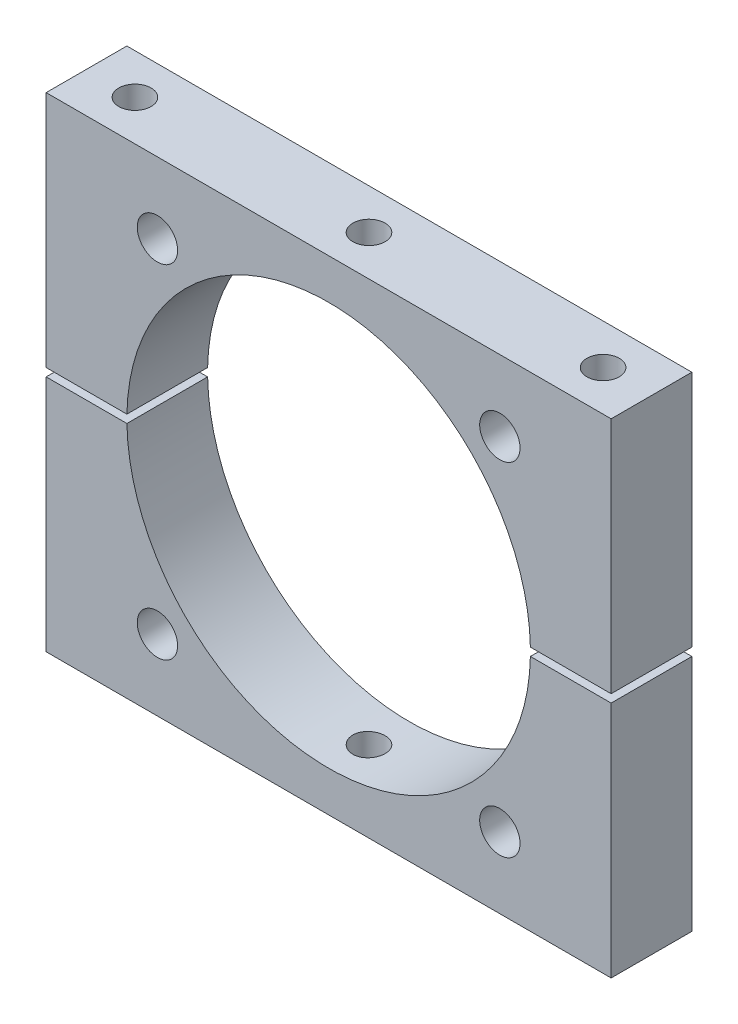
ISO-10303-21;
HEADER;
FILE_DESCRIPTION(('STEP AP214'),'2;1');
FILE_NAME('part.step','',(''),(''),'','','');
FILE_SCHEMA(('AUTOMOTIVE_DESIGN { 1 0 10303 214 1 1 1 1 }'));
ENDSEC;
DATA;
#1=APPLICATION_CONTEXT('core data for automotive mechanical design processes');
#2=APPLICATION_PROTOCOL_DEFINITION('international standard','automotive_design',2000,#1);
#3=PRODUCT_CONTEXT('',#1,'mechanical');
#4=PRODUCT('Part','Part','',(#3));
#5=PRODUCT_RELATED_PRODUCT_CATEGORY('part','',(#4));
#6=PRODUCT_DEFINITION_FORMATION('','',#4);
#7=PRODUCT_DEFINITION_CONTEXT('part definition',#1,'design');
#8=PRODUCT_DEFINITION('design','',#6,#7);
#9=PRODUCT_DEFINITION_SHAPE('','',#8);
#10=(LENGTH_UNIT() NAMED_UNIT(*) SI_UNIT(.MILLI.,.METRE.));
#11=(NAMED_UNIT(*) PLANE_ANGLE_UNIT() SI_UNIT($,.RADIAN.));
#12=(NAMED_UNIT(*) SI_UNIT($,.STERADIAN.) SOLID_ANGLE_UNIT());
#13=UNCERTAINTY_MEASURE_WITH_UNIT(LENGTH_MEASURE(1.E-05),#10,'distance_accuracy_value','');
#14=(GEOMETRIC_REPRESENTATION_CONTEXT(3) GLOBAL_UNCERTAINTY_ASSIGNED_CONTEXT((#13)) GLOBAL_UNIT_ASSIGNED_CONTEXT((#10,
#11,#12)) REPRESENTATION_CONTEXT('',''));
#15=CARTESIAN_POINT('',(0.,0.,0.));
#16=DIRECTION('',(0.,0.,1.));
#17=DIRECTION('',(1.,0.,0.));
#18=AXIS2_PLACEMENT_3D('',#15,#16,#17);
#19=CARTESIAN_POINT('',(0.,0.,10.));
#20=DIRECTION('',(1.,0.,0.));
#21=DIRECTION('',(0.,0.,-1.));
#22=AXIS2_PLACEMENT_3D('',#19,#20,#21);
#23=PLANE('',#22);
#24=DIRECTION('',(0.,-1.,0.));
#25=VECTOR('',#24,1.);
#26=CARTESIAN_POINT('',(0.,0.,10.));
#27=LINE('',#26,#25);
#28=CARTESIAN_POINT('',(0.,29.5,10.));
#29=VERTEX_POINT('',#28);
#30=CARTESIAN_POINT('',(0.,0.,10.));
#31=VERTEX_POINT('',#30);
#32=EDGE_CURVE('E130',#29,#31,#27,.T.);
#33=ORIENTED_EDGE('',*,*,#32,.F.);
#34=DIRECTION('',(0.,0.,1.));
#35=VECTOR('',#34,1.);
#36=CARTESIAN_POINT('',(0.,29.5,0.));
#37=LINE('',#36,#35);
#38=CARTESIAN_POINT('',(0.,29.5,0.));
#39=VERTEX_POINT('',#38);
#40=EDGE_CURVE('E12',#39,#29,#37,.T.);
#41=ORIENTED_EDGE('',*,*,#40,.F.);
#42=DIRECTION('',(0.,-1.,0.));
#43=VECTOR('',#42,1.);
#44=CARTESIAN_POINT('',(0.,0.,0.));
#45=LINE('',#44,#43);
#46=CARTESIAN_POINT('',(0.,0.,0.));
#47=VERTEX_POINT('',#46);
#48=EDGE_CURVE('E132',#39,#47,#45,.T.);
#49=ORIENTED_EDGE('',*,*,#48,.T.);
#50=DIRECTION('',(0.,0.,-1.));
#51=VECTOR('',#50,1.);
#52=CARTESIAN_POINT('',(0.,0.,10.));
#53=LINE('',#52,#51);
#54=EDGE_CURVE('E105',#31,#47,#53,.T.);
#55=ORIENTED_EDGE('',*,*,#54,.F.);
#56=EDGE_LOOP('',(#33,#41,#49,#55));
#57=FACE_BOUND('',#56,.T.);
#58=ADVANCED_FACE('F44',(#57),#23,.F.);
#59=CARTESIAN_POINT('',(0.,0.,10.));
#60=DIRECTION('',(0.,0.,-1.));
#61=DIRECTION('',(-1.,0.,0.));
#62=AXIS2_PLACEMENT_3D('',#59,#60,#61);
#63=PLANE('',#62);
#64=CARTESIAN_POINT('',(56.2132034355966,8.7867965644037,10.));
#65=DIRECTION('',(0.,0.,1.));
#66=DIRECTION('',(1.,0.,0.));
#67=AXIS2_PLACEMENT_3D('',#64,#65,#66);
#68=CIRCLE('',#67,2.5);
#69=CARTESIAN_POINT('',(58.7132034355966,8.7867965644037,10.));
#70=VERTEX_POINT('',#69);
#71=EDGE_CURVE('E211',#70,#70,#68,.T.);
#72=ORIENTED_EDGE('',*,*,#71,.F.);
#73=EDGE_LOOP('',(#72));
#74=FACE_BOUND('',#73,.T.);
#75=CARTESIAN_POINT('',(13.7867965644037,8.78679656440346,10.));
#76=DIRECTION('',(0.,0.,1.));
#77=DIRECTION('',(1.,0.,0.));
#78=AXIS2_PLACEMENT_3D('',#75,#76,#77);
#79=CIRCLE('',#78,2.5);
#80=CARTESIAN_POINT('',(16.2867965644037,8.78679656440346,10.));
#81=VERTEX_POINT('',#80);
#82=EDGE_CURVE('E205',#81,#81,#79,.T.);
#83=ORIENTED_EDGE('',*,*,#82,.F.);
#84=EDGE_LOOP('',(#83));
#85=FACE_BOUND('',#84,.T.);
#86=DIRECTION('',(0.,1.,0.));
#87=VECTOR('',#86,1.);
#88=CARTESIAN_POINT('',(70.,0.,10.));
#89=LINE('',#88,#87);
#90=CARTESIAN_POINT('',(70.,0.,10.));
#91=VERTEX_POINT('',#90);
#92=CARTESIAN_POINT('',(70.,29.5,10.));
#93=VERTEX_POINT('',#92);
#94=EDGE_CURVE('E117',#91,#93,#89,.T.);
#95=ORIENTED_EDGE('',*,*,#94,.T.);
#96=DIRECTION('',(1.,0.,0.));
#97=VECTOR('',#96,1.);
#98=CARTESIAN_POINT('',(70.,29.5,10.));
#99=LINE('',#98,#97);
#100=CARTESIAN_POINT('',(59.9949994999,29.5,10.));
#101=VERTEX_POINT('',#100);
#102=EDGE_CURVE('E118',#101,#93,#99,.T.);
#103=ORIENTED_EDGE('',*,*,#102,.F.);
#104=CARTESIAN_POINT('',(35.,30.,10.));
#105=DIRECTION('',(0.,0.,1.));
#106=DIRECTION('',(1.,0.,0.));
#107=AXIS2_PLACEMENT_3D('',#104,#105,#106);
#108=CIRCLE('',#107,25.);
#109=CARTESIAN_POINT('',(10.0050005001,29.5,10.));
#110=VERTEX_POINT('',#109);
#111=EDGE_CURVE('E190',#110,#101,#108,.T.);
#112=ORIENTED_EDGE('',*,*,#111,.F.);
#113=DIRECTION('',(1.,0.,0.));
#114=VECTOR('',#113,1.);
#115=CARTESIAN_POINT('',(0.,29.5,10.));
#116=LINE('',#115,#114);
#117=EDGE_CURVE('E53',#29,#110,#116,.T.);
#118=ORIENTED_EDGE('',*,*,#117,.F.);
#119=ORIENTED_EDGE('',*,*,#32,.T.);
#120=DIRECTION('',(1.,0.,0.));
#121=VECTOR('',#120,1.);
#122=CARTESIAN_POINT('',(0.,0.,10.));
#123=LINE('',#122,#121);
#124=EDGE_CURVE('E179',#31,#91,#123,.T.);
#125=ORIENTED_EDGE('',*,*,#124,.T.);
#126=EDGE_LOOP('',(#95,#103,#112,#118,#119,#125));
#127=FACE_BOUND('',#126,.T.);
#128=ADVANCED_FACE('F170',(#74,#85,#127),#63,.F.);
#129=CARTESIAN_POINT('',(0.,0.,0.));
#130=DIRECTION('',(0.,0.,-1.));
#131=DIRECTION('',(-1.,0.,0.));
#132=AXIS2_PLACEMENT_3D('',#129,#130,#131);
#133=PLANE('',#132);
#134=CARTESIAN_POINT('',(56.2132034355966,8.7867965644037,0.));
#135=DIRECTION('',(0.,0.,1.));
#136=DIRECTION('',(1.,0.,0.));
#137=AXIS2_PLACEMENT_3D('',#134,#135,#136);
#138=CIRCLE('',#137,2.5);
#139=CARTESIAN_POINT('',(58.7132034355966,8.7867965644037,0.));
#140=VERTEX_POINT('',#139);
#141=EDGE_CURVE('E200',#140,#140,#138,.T.);
#142=ORIENTED_EDGE('',*,*,#141,.T.);
#143=EDGE_LOOP('',(#142));
#144=FACE_BOUND('',#143,.T.);
#145=CARTESIAN_POINT('',(13.7867965644037,8.78679656440346,0.));
#146=DIRECTION('',(0.,0.,1.));
#147=DIRECTION('',(1.,0.,0.));
#148=AXIS2_PLACEMENT_3D('',#145,#146,#147);
#149=CIRCLE('',#148,2.5);
#150=CARTESIAN_POINT('',(16.2867965644037,8.78679656440346,0.));
#151=VERTEX_POINT('',#150);
#152=EDGE_CURVE('E208',#151,#151,#149,.T.);
#153=ORIENTED_EDGE('',*,*,#152,.T.);
#154=EDGE_LOOP('',(#153));
#155=FACE_BOUND('',#154,.T.);
#156=DIRECTION('',(1.,0.,0.));
#157=VECTOR('',#156,1.);
#158=CARTESIAN_POINT('',(70.,29.5,0.));
#159=LINE('',#158,#157);
#160=CARTESIAN_POINT('',(59.9949994999,29.5,0.));
#161=VERTEX_POINT('',#160);
#162=CARTESIAN_POINT('',(70.,29.5,0.));
#163=VERTEX_POINT('',#162);
#164=EDGE_CURVE('E124',#161,#163,#159,.T.);
#165=ORIENTED_EDGE('',*,*,#164,.T.);
#166=DIRECTION('',(0.,1.,0.));
#167=VECTOR('',#166,1.);
#168=CARTESIAN_POINT('',(70.,0.,0.));
#169=LINE('',#168,#167);
#170=CARTESIAN_POINT('',(70.,0.,0.));
#171=VERTEX_POINT('',#170);
#172=EDGE_CURVE('E115',#171,#163,#169,.T.);
#173=ORIENTED_EDGE('',*,*,#172,.F.);
#174=DIRECTION('',(1.,0.,0.));
#175=VECTOR('',#174,1.);
#176=CARTESIAN_POINT('',(0.,0.,0.));
#177=LINE('',#176,#175);
#178=EDGE_CURVE('E98',#47,#171,#177,.T.);
#179=ORIENTED_EDGE('',*,*,#178,.F.);
#180=ORIENTED_EDGE('',*,*,#48,.F.);
#181=DIRECTION('',(1.,0.,0.));
#182=VECTOR('',#181,1.);
#183=CARTESIAN_POINT('',(0.,29.5,0.));
#184=LINE('',#183,#182);
#185=CARTESIAN_POINT('',(10.0050005001,29.5,0.));
#186=VERTEX_POINT('',#185);
#187=EDGE_CURVE('E183',#39,#186,#184,.T.);
#188=ORIENTED_EDGE('',*,*,#187,.T.);
#189=CARTESIAN_POINT('',(35.,30.,0.));
#190=DIRECTION('',(0.,0.,1.));
#191=DIRECTION('',(1.,0.,0.));
#192=AXIS2_PLACEMENT_3D('',#189,#190,#191);
#193=CIRCLE('',#192,25.);
#194=EDGE_CURVE('E109',#186,#161,#193,.T.);
#195=ORIENTED_EDGE('',*,*,#194,.T.);
#196=EDGE_LOOP('',(#165,#173,#179,#180,#188,#195));
#197=FACE_BOUND('',#196,.T.);
#198=ADVANCED_FACE('F122',(#144,#155,#197),#133,.T.);
#199=CARTESIAN_POINT('',(0.,0.,10.));
#200=DIRECTION('',(0.,1.,0.));
#201=DIRECTION('',(0.,0.,1.));
#202=AXIS2_PLACEMENT_3D('',#199,#200,#201);
#203=PLANE('',#202);
#204=CARTESIAN_POINT('',(5.99999999999998,0.,5.));
#205=DIRECTION('',(0.,1.,0.));
#206=DIRECTION('',(-1.,0.,0.));
#207=AXIS2_PLACEMENT_3D('',#204,#205,#206);
#208=CIRCLE('',#207,2.);
#209=CARTESIAN_POINT('',(3.99999999999998,0.,5.));
#210=VERTEX_POINT('',#209);
#211=EDGE_CURVE('E137',#210,#210,#208,.T.);
#212=ORIENTED_EDGE('',*,*,#211,.T.);
#213=EDGE_LOOP('',(#212));
#214=FACE_BOUND('',#213,.T.);
#215=CARTESIAN_POINT('',(64.,0.,5.));
#216=DIRECTION('',(0.,1.,0.));
#217=DIRECTION('',(-1.,0.,0.));
#218=AXIS2_PLACEMENT_3D('',#215,#216,#217);
#219=CIRCLE('',#218,2.);
#220=CARTESIAN_POINT('',(62.,0.,5.));
#221=VERTEX_POINT('',#220);
#222=EDGE_CURVE('E199',#221,#221,#219,.T.);
#223=ORIENTED_EDGE('',*,*,#222,.T.);
#224=EDGE_LOOP('',(#223));
#225=FACE_BOUND('',#224,.T.);
#226=CARTESIAN_POINT('',(35.,0.,5.));
#227=DIRECTION('',(0.,1.,0.));
#228=DIRECTION('',(-1.,0.,0.));
#229=AXIS2_PLACEMENT_3D('',#226,#227,#228);
#230=CIRCLE('',#229,2.);
#231=CARTESIAN_POINT('',(33.,0.,5.));
#232=VERTEX_POINT('',#231);
#233=EDGE_CURVE('E196',#232,#232,#230,.T.);
#234=ORIENTED_EDGE('',*,*,#233,.T.);
#235=EDGE_LOOP('',(#234));
#236=FACE_BOUND('',#235,.T.);
#237=ORIENTED_EDGE('',*,*,#178,.T.);
#238=DIRECTION('',(0.,0.,-1.));
#239=VECTOR('',#238,1.);
#240=CARTESIAN_POINT('',(70.,0.,10.));
#241=LINE('',#240,#239);
#242=EDGE_CURVE('E102',#91,#171,#241,.T.);
#243=ORIENTED_EDGE('',*,*,#242,.F.);
#244=ORIENTED_EDGE('',*,*,#124,.F.);
#245=ORIENTED_EDGE('',*,*,#54,.T.);
#246=EDGE_LOOP('',(#237,#243,#244,#245));
#247=FACE_BOUND('',#246,.T.);
#248=ADVANCED_FACE('F100',(#214,#225,#236,#247),#203,.F.);
#249=CARTESIAN_POINT('',(70.,0.,10.));
#250=DIRECTION('',(-1.,0.,0.));
#251=DIRECTION('',(0.,0.,1.));
#252=AXIS2_PLACEMENT_3D('',#249,#250,#251);
#253=PLANE('',#252);
#254=ORIENTED_EDGE('',*,*,#172,.T.);
#255=DIRECTION('',(0.,0.,1.));
#256=VECTOR('',#255,1.);
#257=CARTESIAN_POINT('',(70.,29.5,0.));
#258=LINE('',#257,#256);
#259=EDGE_CURVE('E119',#163,#93,#258,.T.);
#260=ORIENTED_EDGE('',*,*,#259,.T.);
#261=ORIENTED_EDGE('',*,*,#94,.F.);
#262=ORIENTED_EDGE('',*,*,#242,.T.);
#263=EDGE_LOOP('',(#254,#260,#261,#262));
#264=FACE_BOUND('',#263,.T.);
#265=ADVANCED_FACE('F113',(#264),#253,.F.);
#266=CARTESIAN_POINT('',(70.,29.5,0.));
#267=DIRECTION('',(0.,-1.,0.));
#268=DIRECTION('',(1.,0.,0.));
#269=AXIS2_PLACEMENT_3D('',#266,#267,#268);
#270=PLANE('',#269);
#271=CARTESIAN_POINT('',(64.,29.5,5.));
#272=DIRECTION('',(0.,-1.,0.));
#273=DIRECTION('',(1.,0.,0.));
#274=AXIS2_PLACEMENT_3D('',#271,#272,#273);
#275=CIRCLE('',#274,2.);
#276=CARTESIAN_POINT('',(66.,29.5,5.));
#277=VERTEX_POINT('',#276);
#278=EDGE_CURVE('E47',#277,#277,#275,.T.);
#279=ORIENTED_EDGE('',*,*,#278,.T.);
#280=EDGE_LOOP('',(#279));
#281=FACE_BOUND('',#280,.T.);
#282=ORIENTED_EDGE('',*,*,#102,.T.);
#283=ORIENTED_EDGE('',*,*,#259,.F.);
#284=ORIENTED_EDGE('',*,*,#164,.F.);
#285=DIRECTION('',(0.,0.,1.));
#286=VECTOR('',#285,1.);
#287=CARTESIAN_POINT('',(59.9949994999,29.5,0.));
#288=LINE('',#287,#286);
#289=EDGE_CURVE('E76',#161,#101,#288,.T.);
#290=ORIENTED_EDGE('',*,*,#289,.T.);
#291=EDGE_LOOP('',(#282,#283,#284,#290));
#292=FACE_BOUND('',#291,.T.);
#293=ADVANCED_FACE('F167',(#281,#292),#270,.F.);
#294=CARTESIAN_POINT('',(35.,30.,0.));
#295=DIRECTION('',(0.,0.,1.));
#296=DIRECTION('',(1.,0.,0.));
#297=AXIS2_PLACEMENT_3D('',#294,#295,#296);
#298=CYLINDRICAL_SURFACE('',#297,25.);
#299=CARTESIAN_POINT('',(33.,5.08012841124579,5.));
#300=CARTESIAN_POINT('',(33.0000049058297,5.08012734773147,4.88785214632583));
#301=CARTESIAN_POINT('',(33.0094645837975,5.07936320771224,4.77562755360826));
#302=CARTESIAN_POINT('',(33.0470624163415,5.07638917242891,4.55428234358477));
#303=CARTESIAN_POINT('',(33.0752218385444,5.07417763104509,4.4451654082191));
#304=CARTESIAN_POINT('',(33.1494005463485,5.06856087303916,4.23327344182202));
#305=CARTESIAN_POINT('',(33.1954098318099,5.06515632488582,4.13049489709423));
#306=CARTESIAN_POINT('',(33.3039647194289,5.05753799933324,3.93414429234462));
#307=CARTESIAN_POINT('',(33.3665067414178,5.05332439718886,3.84057024509866));
#308=CARTESIAN_POINT('',(33.5065126422468,5.04455147782463,3.66503758891781));
#309=CARTESIAN_POINT('',(33.5840076675593,5.03999145125225,3.58310385583312));
#310=CARTESIAN_POINT('',(33.7516540723195,5.03104599547927,3.43339121946791));
#311=CARTESIAN_POINT('',(33.8418059998821,5.0266605738506,3.36561292951396));
#312=CARTESIAN_POINT('',(34.0323544420321,5.01855180621899,3.24605323296989));
#313=CARTESIAN_POINT('',(34.1327644244599,5.01482934866933,3.19429322537689));
#314=CARTESIAN_POINT('',(34.3408846785481,5.00847355216113,3.10837625933676));
#315=CARTESIAN_POINT('',(34.4485948313103,5.0058401954693,3.07421901427029));
#316=CARTESIAN_POINT('',(34.6680113389855,5.001964259375,3.02454843680447));
#317=CARTESIAN_POINT('',(34.7797085663302,5.00071869027013,3.00899502094729));
#318=CARTESIAN_POINT('',(35.0041346856336,4.99974854930884,2.9968497166359));
#319=CARTESIAN_POINT('',(35.1168635597254,5.00002395116042,3.00025750041233));
#320=CARTESIAN_POINT('',(35.339881278461,5.00206225037521,3.02590503221525));
#321=CARTESIAN_POINT('',(35.4501751157608,5.0038217429086,3.04810167488849));
#322=CARTESIAN_POINT('',(35.6654666002531,5.00862637101554,3.11062984172019));
#323=CARTESIAN_POINT('',(35.7704642004069,5.01167151800542,3.15096152691411));
#324=CARTESIAN_POINT('',(35.9723201008381,5.0187106835816,3.24866309042891));
#325=CARTESIAN_POINT('',(36.0691689982204,5.02270577853434,3.30605231487255));
#326=CARTESIAN_POINT('',(36.2518756725195,5.03119575879567,3.43622583750934));
#327=CARTESIAN_POINT('',(36.3377332442022,5.03569065343378,3.50901042310295));
#328=CARTESIAN_POINT('',(36.4962720389694,5.04468981488671,3.66815161626229));
#329=CARTESIAN_POINT('',(36.5689156773006,5.04919407268298,3.75454567206777));
#330=CARTESIAN_POINT('',(36.6986742538885,5.05769161227713,3.93832276653583));
#331=CARTESIAN_POINT('',(36.7557891807526,5.06168489370012,4.03570581326042));
#332=CARTESIAN_POINT('',(36.8528673981887,5.06870915540073,4.23872248572451));
#333=CARTESIAN_POINT('',(36.8928288041141,5.0717400299298,4.34435701654316));
#334=CARTESIAN_POINT('',(36.9544381331901,5.0764943330086,4.56086578550857));
#335=CARTESIAN_POINT('',(36.9760864107929,5.07821778686352,4.67173992219839));
#336=CARTESIAN_POINT('',(37.000407523715,5.08015808256602,4.89525189649534));
#337=CARTESIAN_POINT('',(37.0031327414394,5.0803790834359,5.00788399962282));
#338=CARTESIAN_POINT('',(36.9896675278023,5.07930043172132,5.23200349472847));
#339=CARTESIAN_POINT('',(36.9734772588428,5.07800079219257,5.34349089652637));
#340=CARTESIAN_POINT('',(36.9226842955202,5.07403109312339,5.56200629468562));
#341=CARTESIAN_POINT('',(36.8881059892899,5.07136284893502,5.66903999573583));
#342=CARTESIAN_POINT('',(36.8015432785373,5.06495810211958,5.87578629884753));
#343=CARTESIAN_POINT('',(36.7495586162864,5.06122158367515,5.97549879248032));
#344=CARTESIAN_POINT('',(36.6295260627595,5.05309122361194,6.16501207928401));
#345=CARTESIAN_POINT('',(36.561443230421,5.04869595989389,6.25479067981361));
#346=CARTESIAN_POINT('',(36.4111974912002,5.03974819229543,6.4216635305496));
#347=CARTESIAN_POINT('',(36.3290343608448,5.03519568592029,6.49875757939722));
#348=CARTESIAN_POINT('',(36.1527341363514,5.02643404533033,6.63825137667553));
#349=CARTESIAN_POINT('',(36.0585700870042,5.02222572023454,6.70061711536531));
#350=CARTESIAN_POINT('',(35.8610755210211,5.01463826185632,6.80865071989545));
#351=CARTESIAN_POINT('',(35.7577450898037,5.0112591208481,6.85431874131599));
#352=CARTESIAN_POINT('',(35.5449733633069,5.00571451349841,6.92760202065291));
#353=CARTESIAN_POINT('',(35.4355393803821,5.00354762776069,6.95523839765751));
#354=CARTESIAN_POINT('',(35.2135664449589,5.00066593349759,6.99174293337583));
#355=CARTESIAN_POINT('',(35.1010275462014,4.99995109985558,7.00061141672435));
#356=CARTESIAN_POINT('',(34.8763748177972,5.00005400574249,6.99932476322648));
#357=CARTESIAN_POINT('',(34.7642606785877,5.00086747220173,6.98922266744312));
#358=CARTESIAN_POINT('',(34.543326600899,5.00392711142839,6.95039211378512));
#359=CARTESIAN_POINT('',(34.434506667172,5.00617328626259,6.92166362904064));
#360=CARTESIAN_POINT('',(34.2232458147354,5.01184624477969,6.84640903482433));
#361=CARTESIAN_POINT('',(34.1208045965354,5.01527297298441,6.79988376167241));
#362=CARTESIAN_POINT('',(33.9251787543047,5.02292342725981,6.69036249537071));
#363=CARTESIAN_POINT('',(33.8319939672824,5.02714713929305,6.62736679231073));
#364=CARTESIAN_POINT('',(33.6572549348515,5.03593135912912,6.48649399715609));
#365=CARTESIAN_POINT('',(33.5757323027529,5.04049273335708,6.40857774622938));
#366=CARTESIAN_POINT('',(33.4268903357378,5.04943083951522,6.24014438954589));
#367=CARTESIAN_POINT('',(33.3595744515429,5.05380752638004,6.14962423122778));
#368=CARTESIAN_POINT('',(33.2409732717279,5.06188908798036,5.95839006551097));
#369=CARTESIAN_POINT('',(33.1897163652296,5.06559276817313,5.85765841750696));
#370=CARTESIAN_POINT('',(33.1049085973296,5.07189429980017,5.64905850357319));
#371=CARTESIAN_POINT('',(33.0713373109053,5.07449342620347,5.54119863279941));
#372=CARTESIAN_POINT('',(33.0314354938912,5.0776208301853,5.36058173591769));
#373=CARTESIAN_POINT('',(33.0196627768964,5.07855687212748,5.28898746472167));
#374=CARTESIAN_POINT('',(33.003943454081,5.07981100560018,5.14493948037199));
#375=CARTESIAN_POINT('',(32.9999968291605,5.08012909863883,5.07248576931625));
#376=CARTESIAN_POINT('',(33.,5.08012841124579,5.));
#377=B_SPLINE_CURVE_WITH_KNOTS('',3,(#299,#300,#301,#302,#303,#304,#305,#306,#307,#308,#309,
#310,#311,#312,#313,#314,#315,#316,#317,#318,#319,#320,#321,#322,#323,#324,#325,#326,#327,#328,
#329,#330,#331,#332,#333,#334,#335,#336,#337,#338,#339,#340,#341,#342,#343,#344,#345,#346,#347,
#348,#349,#350,#351,#352,#353,#354,#355,#356,#357,#358,#359,#360,#361,#362,#363,#364,#365,#366,
#367,#368,#369,#370,#371,#372,#373,#374,#375,#376),.UNSPECIFIED.,.T.,.F.,(4,2,2,2,2,2,2,2,2,2,2,
2,2,2,2,2,2,2,2,2,2,2,2,2,2,2,2,2,2,2,2,2,2,2,2,2,2,2,4),(0.,0.33617890938388,0.672740818698467,
1.00911444549431,1.34541529007444,1.68242434822536,2.0194480052657,2.35691997146201,
2.69438644255223,3.03112449746249,3.36785673142908,3.70381852241059,4.03978329672298,
4.37613057520016,4.71248413315914,5.04977992078599,5.38707595587001,5.72440903998027,
6.06173559482743,6.39812799600616,6.73451750905467,7.07046197594159,7.40641141723674,
7.7430968405756,8.07978760805434,8.41724840176262,8.75470605111592,9.09176774920682,
9.42882361697637,9.76493849142071,10.101053850735,10.4371534170066,10.7732470640349,
11.1102351838792,11.4473050618615,11.7849674942507,12.1222391025421,12.3395258855511,
12.5568121382634),.UNSPECIFIED.);
#378=CARTESIAN_POINT('',(33.,5.08012841124579,5.));
#379=VERTEX_POINT('',#378);
#380=EDGE_CURVE('E136',#379,#379,#377,.T.);
#381=ORIENTED_EDGE('',*,*,#380,.T.);
#382=EDGE_LOOP('',(#381));
#383=FACE_BOUND('',#382,.T.);
#384=ORIENTED_EDGE('',*,*,#111,.T.);
#385=ORIENTED_EDGE('',*,*,#289,.F.);
#386=ORIENTED_EDGE('',*,*,#194,.F.);
#387=DIRECTION('',(0.,0.,1.));
#388=VECTOR('',#387,1.);
#389=CARTESIAN_POINT('',(10.0050005001,29.5,0.));
#390=LINE('',#389,#388);
#391=EDGE_CURVE('E189',#186,#110,#390,.T.);
#392=ORIENTED_EDGE('',*,*,#391,.T.);
#393=EDGE_LOOP('',(#384,#385,#386,#392));
#394=FACE_BOUND('',#393,.T.);
#395=ADVANCED_FACE('F144',(#383,#394),#298,.F.);
#396=CARTESIAN_POINT('',(0.,29.5,0.));
#397=DIRECTION('',(0.,-1.,0.));
#398=DIRECTION('',(1.,0.,0.));
#399=AXIS2_PLACEMENT_3D('',#396,#397,#398);
#400=PLANE('',#399);
#401=CARTESIAN_POINT('',(5.99999999999999,29.5,5.));
#402=DIRECTION('',(0.,-1.,0.));
#403=DIRECTION('',(1.,0.,0.));
#404=AXIS2_PLACEMENT_3D('',#401,#402,#403);
#405=CIRCLE('',#404,2.);
#406=CARTESIAN_POINT('',(7.99999999999999,29.5,5.));
#407=VERTEX_POINT('',#406);
#408=EDGE_CURVE('E134',#407,#407,#405,.T.);
#409=ORIENTED_EDGE('',*,*,#408,.T.);
#410=EDGE_LOOP('',(#409));
#411=FACE_BOUND('',#410,.T.);
#412=ORIENTED_EDGE('',*,*,#117,.T.);
#413=ORIENTED_EDGE('',*,*,#391,.F.);
#414=ORIENTED_EDGE('',*,*,#187,.F.);
#415=ORIENTED_EDGE('',*,*,#40,.T.);
#416=EDGE_LOOP('',(#412,#413,#414,#415));
#417=FACE_BOUND('',#416,.T.);
#418=ADVANCED_FACE('F159',(#411,#417),#400,.F.);
#419=CARTESIAN_POINT('',(5.99999999999998,0.,5.));
#420=DIRECTION('',(0.,1.,0.));
#421=DIRECTION('',(-1.,0.,0.));
#422=AXIS2_PLACEMENT_3D('',#419,#420,#421);
#423=CYLINDRICAL_SURFACE('',#422,2.);
#424=ORIENTED_EDGE('',*,*,#211,.F.);
#425=EDGE_LOOP('',(#424));
#426=FACE_BOUND('',#425,.T.);
#427=ORIENTED_EDGE('',*,*,#408,.F.);
#428=EDGE_LOOP('',(#427));
#429=FACE_BOUND('',#428,.T.);
#430=ADVANCED_FACE('F154',(#426,#429),#423,.F.);
#431=CARTESIAN_POINT('',(35.,0.,5.));
#432=DIRECTION('',(0.,1.,0.));
#433=DIRECTION('',(-1.,0.,0.));
#434=AXIS2_PLACEMENT_3D('',#431,#432,#433);
#435=CYLINDRICAL_SURFACE('',#434,2.);
#436=ORIENTED_EDGE('',*,*,#233,.F.);
#437=EDGE_LOOP('',(#436));
#438=FACE_BOUND('',#437,.T.);
#439=ORIENTED_EDGE('',*,*,#380,.F.);
#440=EDGE_LOOP('',(#439));
#441=FACE_BOUND('',#440,.T.);
#442=ADVANCED_FACE('F148',(#438,#441),#435,.F.);
#443=CARTESIAN_POINT('',(64.,0.,5.));
#444=DIRECTION('',(0.,1.,0.));
#445=DIRECTION('',(-1.,0.,0.));
#446=AXIS2_PLACEMENT_3D('',#443,#444,#445);
#447=CYLINDRICAL_SURFACE('',#446,2.);
#448=ORIENTED_EDGE('',*,*,#222,.F.);
#449=EDGE_LOOP('',(#448));
#450=FACE_BOUND('',#449,.T.);
#451=ORIENTED_EDGE('',*,*,#278,.F.);
#452=EDGE_LOOP('',(#451));
#453=FACE_BOUND('',#452,.T.);
#454=ADVANCED_FACE('F153',(#450,#453),#447,.F.);
#455=CARTESIAN_POINT('',(13.7867965644037,8.78679656440346,0.));
#456=DIRECTION('',(0.,0.,1.));
#457=DIRECTION('',(1.,0.,0.));
#458=AXIS2_PLACEMENT_3D('',#455,#456,#457);
#459=CYLINDRICAL_SURFACE('',#458,2.5);
#460=ORIENTED_EDGE('',*,*,#152,.F.);
#461=EDGE_LOOP('',(#460));
#462=FACE_BOUND('',#461,.T.);
#463=ORIENTED_EDGE('',*,*,#82,.T.);
#464=EDGE_LOOP('',(#463));
#465=FACE_BOUND('',#464,.T.);
#466=ADVANCED_FACE('F222',(#462,#465),#459,.F.);
#467=CARTESIAN_POINT('',(56.2132034355966,8.7867965644037,0.));
#468=DIRECTION('',(0.,0.,1.));
#469=DIRECTION('',(1.,0.,0.));
#470=AXIS2_PLACEMENT_3D('',#467,#468,#469);
#471=CYLINDRICAL_SURFACE('',#470,2.5);
#472=ORIENTED_EDGE('',*,*,#141,.F.);
#473=EDGE_LOOP('',(#472));
#474=FACE_BOUND('',#473,.T.);
#475=ORIENTED_EDGE('',*,*,#71,.T.);
#476=EDGE_LOOP('',(#475));
#477=FACE_BOUND('',#476,.T.);
#478=ADVANCED_FACE('F219',(#474,#477),#471,.F.);
#479=CLOSED_SHELL('',(#58,#128,#198,#248,#265,#293,#395,#418,#430,#442,#454,#466,#478));
#480=MANIFOLD_SOLID_BREP('B2',#479);
#481=CARTESIAN_POINT('',(0.,60.,10.));
#482=DIRECTION('',(0.,-1.,0.));
#483=DIRECTION('',(0.,0.,-1.));
#484=AXIS2_PLACEMENT_3D('',#481,#482,#483);
#485=PLANE('',#484);
#486=CARTESIAN_POINT('',(6.,60.,5.));
#487=DIRECTION('',(0.,1.,0.));
#488=DIRECTION('',(-1.,0.,0.));
#489=AXIS2_PLACEMENT_3D('',#486,#487,#488);
#490=CIRCLE('',#489,2.);
#491=CARTESIAN_POINT('',(4.,60.,5.));
#492=VERTEX_POINT('',#491);
#493=EDGE_CURVE('E402',#492,#492,#490,.T.);
#494=ORIENTED_EDGE('',*,*,#493,.F.);
#495=EDGE_LOOP('',(#494));
#496=FACE_BOUND('',#495,.T.);
#497=CARTESIAN_POINT('',(64.,60.,5.));
#498=DIRECTION('',(0.,1.,0.));
#499=DIRECTION('',(-1.,0.,0.));
#500=AXIS2_PLACEMENT_3D('',#497,#498,#499);
#501=CIRCLE('',#500,2.);
#502=CARTESIAN_POINT('',(62.,60.,5.));
#503=VERTEX_POINT('',#502);
#504=EDGE_CURVE('E476',#503,#503,#501,.T.);
#505=ORIENTED_EDGE('',*,*,#504,.F.);
#506=EDGE_LOOP('',(#505));
#507=FACE_BOUND('',#506,.T.);
#508=CARTESIAN_POINT('',(35.,60.,5.));
#509=DIRECTION('',(0.,1.,0.));
#510=DIRECTION('',(-1.,0.,0.));
#511=AXIS2_PLACEMENT_3D('',#508,#509,#510);
#512=CIRCLE('',#511,2.);
#513=CARTESIAN_POINT('',(33.,60.,5.));
#514=VERTEX_POINT('',#513);
#515=EDGE_CURVE('E473',#514,#514,#512,.T.);
#516=ORIENTED_EDGE('',*,*,#515,.F.);
#517=EDGE_LOOP('',(#516));
#518=FACE_BOUND('',#517,.T.);
#519=DIRECTION('',(-1.,0.,0.));
#520=VECTOR('',#519,1.);
#521=CARTESIAN_POINT('',(0.,60.,0.));
#522=LINE('',#521,#520);
#523=CARTESIAN_POINT('',(70.,60.,0.));
#524=VERTEX_POINT('',#523);
#525=CARTESIAN_POINT('',(0.,60.,0.));
#526=VERTEX_POINT('',#525);
#527=EDGE_CURVE('E367',#524,#526,#522,.T.);
#528=ORIENTED_EDGE('',*,*,#527,.T.);
#529=DIRECTION('',(0.,0.,-1.));
#530=VECTOR('',#529,1.);
#531=CARTESIAN_POINT('',(0.,60.,10.));
#532=LINE('',#531,#530);
#533=CARTESIAN_POINT('',(0.,60.,10.));
#534=VERTEX_POINT('',#533);
#535=EDGE_CURVE('E338',#534,#526,#532,.T.);
#536=ORIENTED_EDGE('',*,*,#535,.F.);
#537=DIRECTION('',(-1.,0.,0.));
#538=VECTOR('',#537,1.);
#539=CARTESIAN_POINT('',(0.,60.,10.));
#540=LINE('',#539,#538);
#541=CARTESIAN_POINT('',(70.,60.,10.));
#542=VERTEX_POINT('',#541);
#543=EDGE_CURVE('E355',#542,#534,#540,.T.);
#544=ORIENTED_EDGE('',*,*,#543,.F.);
#545=DIRECTION('',(0.,0.,-1.));
#546=VECTOR('',#545,1.);
#547=CARTESIAN_POINT('',(70.,60.,10.));
#548=LINE('',#547,#546);
#549=EDGE_CURVE('E42',#542,#524,#548,.T.);
#550=ORIENTED_EDGE('',*,*,#549,.T.);
#551=EDGE_LOOP('',(#528,#536,#544,#550));
#552=FACE_BOUND('',#551,.T.);
#553=ADVANCED_FACE('F329',(#496,#507,#518,#552),#485,.F.);
#554=CARTESIAN_POINT('',(0.,0.,0.));
#555=DIRECTION('',(0.,0.,-1.));
#556=DIRECTION('',(-1.,0.,0.));
#557=AXIS2_PLACEMENT_3D('',#554,#555,#556);
#558=PLANE('',#557);
#559=CARTESIAN_POINT('',(13.7867965644035,51.2132034355963,0.));
#560=DIRECTION('',(0.,0.,1.));
#561=DIRECTION('',(1.,0.,0.));
#562=AXIS2_PLACEMENT_3D('',#559,#560,#561);
#563=CIRCLE('',#562,2.5);
#564=CARTESIAN_POINT('',(16.2867965644035,51.2132034355963,0.));
#565=VERTEX_POINT('',#564);
#566=EDGE_CURVE('E477',#565,#565,#563,.T.);
#567=ORIENTED_EDGE('',*,*,#566,.T.);
#568=EDGE_LOOP('',(#567));
#569=FACE_BOUND('',#568,.T.);
#570=CARTESIAN_POINT('',(56.2132034355963,51.2132034355965,0.));
#571=DIRECTION('',(0.,0.,1.));
#572=DIRECTION('',(1.,0.,0.));
#573=AXIS2_PLACEMENT_3D('',#570,#571,#572);
#574=CIRCLE('',#573,2.50000000000001);
#575=CARTESIAN_POINT('',(58.7132034355963,51.2132034355965,0.));
#576=VERTEX_POINT('',#575);
#577=EDGE_CURVE('E485',#576,#576,#574,.T.);
#578=ORIENTED_EDGE('',*,*,#577,.T.);
#579=EDGE_LOOP('',(#578));
#580=FACE_BOUND('',#579,.T.);
#581=DIRECTION('',(-1.,0.,0.));
#582=VECTOR('',#581,1.);
#583=CARTESIAN_POINT('',(59.9949994999,30.5,0.));
#584=LINE('',#583,#582);
#585=CARTESIAN_POINT('',(70.,30.5,0.));
#586=VERTEX_POINT('',#585);
#587=CARTESIAN_POINT('',(59.9949994999,30.5,0.));
#588=VERTEX_POINT('',#587);
#589=EDGE_CURVE('E458',#586,#588,#584,.T.);
#590=ORIENTED_EDGE('',*,*,#589,.T.);
#591=CARTESIAN_POINT('',(35.,30.,0.));
#592=DIRECTION('',(0.,0.,1.));
#593=DIRECTION('',(1.,0.,0.));
#594=AXIS2_PLACEMENT_3D('',#591,#592,#593);
#595=CIRCLE('',#594,25.);
#596=CARTESIAN_POINT('',(10.0050005001,30.5,0.));
#597=VERTEX_POINT('',#596);
#598=EDGE_CURVE('E464',#588,#597,#595,.T.);
#599=ORIENTED_EDGE('',*,*,#598,.T.);
#600=DIRECTION('',(-1.,0.,0.));
#601=VECTOR('',#600,1.);
#602=CARTESIAN_POINT('',(10.0050005001,30.5,0.));
#603=LINE('',#602,#601);
#604=CARTESIAN_POINT('',(0.,30.5,0.));
#605=VERTEX_POINT('',#604);
#606=EDGE_CURVE('E384',#597,#605,#603,.T.);
#607=ORIENTED_EDGE('',*,*,#606,.T.);
#608=DIRECTION('',(0.,-1.,0.));
#609=VECTOR('',#608,1.);
#610=CARTESIAN_POINT('',(0.,0.,0.));
#611=LINE('',#610,#609);
#612=EDGE_CURVE('E379',#526,#605,#611,.T.);
#613=ORIENTED_EDGE('',*,*,#612,.F.);
#614=ORIENTED_EDGE('',*,*,#527,.F.);
#615=DIRECTION('',(0.,1.,0.));
#616=VECTOR('',#615,1.);
#617=CARTESIAN_POINT('',(70.,0.,0.));
#618=LINE('',#617,#616);
#619=EDGE_CURVE('E375',#586,#524,#618,.T.);
#620=ORIENTED_EDGE('',*,*,#619,.F.);
#621=EDGE_LOOP('',(#590,#599,#607,#613,#614,#620));
#622=FACE_BOUND('',#621,.T.);
#623=ADVANCED_FACE('F382',(#569,#580,#622),#558,.T.);
#624=CARTESIAN_POINT('',(0.,0.,10.));
#625=DIRECTION('',(0.,0.,-1.));
#626=DIRECTION('',(-1.,0.,0.));
#627=AXIS2_PLACEMENT_3D('',#624,#625,#626);
#628=PLANE('',#627);
#629=CARTESIAN_POINT('',(13.7867965644035,51.2132034355963,10.));
#630=DIRECTION('',(0.,0.,1.));
#631=DIRECTION('',(1.,0.,0.));
#632=AXIS2_PLACEMENT_3D('',#629,#630,#631);
#633=CIRCLE('',#632,2.5);
#634=CARTESIAN_POINT('',(16.2867965644035,51.2132034355963,10.));
#635=VERTEX_POINT('',#634);
#636=EDGE_CURVE('E488',#635,#635,#633,.T.);
#637=ORIENTED_EDGE('',*,*,#636,.F.);
#638=EDGE_LOOP('',(#637));
#639=FACE_BOUND('',#638,.T.);
#640=CARTESIAN_POINT('',(56.2132034355963,51.2132034355965,10.));
#641=DIRECTION('',(0.,0.,1.));
#642=DIRECTION('',(1.,0.,0.));
#643=AXIS2_PLACEMENT_3D('',#640,#641,#642);
#644=CIRCLE('',#643,2.50000000000001);
#645=CARTESIAN_POINT('',(58.7132034355963,51.2132034355965,10.));
#646=VERTEX_POINT('',#645);
#647=EDGE_CURVE('E482',#646,#646,#644,.T.);
#648=ORIENTED_EDGE('',*,*,#647,.F.);
#649=EDGE_LOOP('',(#648));
#650=FACE_BOUND('',#649,.T.);
#651=CARTESIAN_POINT('',(35.,30.,10.));
#652=DIRECTION('',(0.,0.,1.));
#653=DIRECTION('',(1.,0.,0.));
#654=AXIS2_PLACEMENT_3D('',#651,#652,#653);
#655=CIRCLE('',#654,25.);
#656=CARTESIAN_POINT('',(59.9949994999,30.5,10.));
#657=VERTEX_POINT('',#656);
#658=CARTESIAN_POINT('',(10.0050005001,30.5,10.));
#659=VERTEX_POINT('',#658);
#660=EDGE_CURVE('E467',#657,#659,#655,.T.);
#661=ORIENTED_EDGE('',*,*,#660,.F.);
#662=DIRECTION('',(-1.,0.,0.));
#663=VECTOR('',#662,1.);
#664=CARTESIAN_POINT('',(59.9949994999,30.5,10.));
#665=LINE('',#664,#663);
#666=CARTESIAN_POINT('',(70.,30.5,10.));
#667=VERTEX_POINT('',#666);
#668=EDGE_CURVE('E461',#667,#657,#665,.T.);
#669=ORIENTED_EDGE('',*,*,#668,.F.);
#670=DIRECTION('',(0.,1.,0.));
#671=VECTOR('',#670,1.);
#672=CARTESIAN_POINT('',(70.,0.,10.));
#673=LINE('',#672,#671);
#674=EDGE_CURVE('E446',#667,#542,#673,.T.);
#675=ORIENTED_EDGE('',*,*,#674,.T.);
#676=ORIENTED_EDGE('',*,*,#543,.T.);
#677=DIRECTION('',(0.,-1.,0.));
#678=VECTOR('',#677,1.);
#679=CARTESIAN_POINT('',(0.,0.,10.));
#680=LINE('',#679,#678);
#681=CARTESIAN_POINT('',(0.,30.5,10.));
#682=VERTEX_POINT('',#681);
#683=EDGE_CURVE('E374',#534,#682,#680,.T.);
#684=ORIENTED_EDGE('',*,*,#683,.T.);
#685=DIRECTION('',(-1.,0.,0.));
#686=VECTOR('',#685,1.);
#687=CARTESIAN_POINT('',(10.0050005001,30.5,10.));
#688=LINE('',#687,#686);
#689=EDGE_CURVE('E465',#659,#682,#688,.T.);
#690=ORIENTED_EDGE('',*,*,#689,.F.);
#691=EDGE_LOOP('',(#661,#669,#675,#676,#684,#690));
#692=FACE_BOUND('',#691,.T.);
#693=ADVANCED_FACE('F432',(#639,#650,#692),#628,.F.);
#694=CARTESIAN_POINT('',(70.,0.,10.));
#695=DIRECTION('',(-1.,0.,0.));
#696=DIRECTION('',(0.,0.,1.));
#697=AXIS2_PLACEMENT_3D('',#694,#695,#696);
#698=PLANE('',#697);
#699=ORIENTED_EDGE('',*,*,#674,.F.);
#700=DIRECTION('',(0.,0.,1.));
#701=VECTOR('',#700,1.);
#702=CARTESIAN_POINT('',(70.,30.5,0.));
#703=LINE('',#702,#701);
#704=EDGE_CURVE('E389',#586,#667,#703,.T.);
#705=ORIENTED_EDGE('',*,*,#704,.F.);
#706=ORIENTED_EDGE('',*,*,#619,.T.);
#707=ORIENTED_EDGE('',*,*,#549,.F.);
#708=EDGE_LOOP('',(#699,#705,#706,#707));
#709=FACE_BOUND('',#708,.T.);
#710=ADVANCED_FACE('F424',(#709),#698,.F.);
#711=CARTESIAN_POINT('',(0.,0.,10.));
#712=DIRECTION('',(1.,0.,0.));
#713=DIRECTION('',(0.,0.,-1.));
#714=AXIS2_PLACEMENT_3D('',#711,#712,#713);
#715=PLANE('',#714);
#716=ORIENTED_EDGE('',*,*,#612,.T.);
#717=DIRECTION('',(0.,0.,1.));
#718=VECTOR('',#717,1.);
#719=CARTESIAN_POINT('',(0.,30.5,0.));
#720=LINE('',#719,#718);
#721=EDGE_CURVE('E346',#605,#682,#720,.T.);
#722=ORIENTED_EDGE('',*,*,#721,.T.);
#723=ORIENTED_EDGE('',*,*,#683,.F.);
#724=ORIENTED_EDGE('',*,*,#535,.T.);
#725=EDGE_LOOP('',(#716,#722,#723,#724));
#726=FACE_BOUND('',#725,.T.);
#727=ADVANCED_FACE('F331',(#726),#715,.F.);
#728=CARTESIAN_POINT('',(10.0050005001,30.5,0.));
#729=DIRECTION('',(0.,1.,0.));
#730=DIRECTION('',(0.,0.,1.));
#731=AXIS2_PLACEMENT_3D('',#728,#729,#730);
#732=PLANE('',#731);
#733=CARTESIAN_POINT('',(5.99999999999999,30.5,5.));
#734=DIRECTION('',(0.,1.,0.));
#735=DIRECTION('',(0.,0.,1.));
#736=AXIS2_PLACEMENT_3D('',#733,#734,#735);
#737=CIRCLE('',#736,2.);
#738=CARTESIAN_POINT('',(5.99999999999999,30.5,7.));
#739=VERTEX_POINT('',#738);
#740=EDGE_CURVE('E333',#739,#739,#737,.T.);
#741=ORIENTED_EDGE('',*,*,#740,.T.);
#742=EDGE_LOOP('',(#741));
#743=FACE_BOUND('',#742,.T.);
#744=ORIENTED_EDGE('',*,*,#689,.T.);
#745=ORIENTED_EDGE('',*,*,#721,.F.);
#746=ORIENTED_EDGE('',*,*,#606,.F.);
#747=DIRECTION('',(0.,0.,1.));
#748=VECTOR('',#747,1.);
#749=CARTESIAN_POINT('',(10.0050005001,30.5,0.));
#750=LINE('',#749,#748);
#751=EDGE_CURVE('E455',#597,#659,#750,.T.);
#752=ORIENTED_EDGE('',*,*,#751,.T.);
#753=EDGE_LOOP('',(#744,#745,#746,#752));
#754=FACE_BOUND('',#753,.T.);
#755=ADVANCED_FACE('F417',(#743,#754),#732,.F.);
#756=CARTESIAN_POINT('',(59.9949994999,30.5,0.));
#757=DIRECTION('',(0.,1.,0.));
#758=DIRECTION('',(-1.,0.,0.));
#759=AXIS2_PLACEMENT_3D('',#756,#757,#758);
#760=PLANE('',#759);
#761=CARTESIAN_POINT('',(64.,30.5,5.));
#762=DIRECTION('',(0.,1.,0.));
#763=DIRECTION('',(-1.,0.,0.));
#764=AXIS2_PLACEMENT_3D('',#761,#762,#763);
#765=CIRCLE('',#764,2.);
#766=CARTESIAN_POINT('',(62.,30.5,5.));
#767=VERTEX_POINT('',#766);
#768=EDGE_CURVE('E401',#767,#767,#765,.T.);
#769=ORIENTED_EDGE('',*,*,#768,.T.);
#770=EDGE_LOOP('',(#769));
#771=FACE_BOUND('',#770,.T.);
#772=ORIENTED_EDGE('',*,*,#668,.T.);
#773=DIRECTION('',(0.,0.,1.));
#774=VECTOR('',#773,1.);
#775=CARTESIAN_POINT('',(59.9949994999,30.5,0.));
#776=LINE('',#775,#774);
#777=EDGE_CURVE('E385',#588,#657,#776,.T.);
#778=ORIENTED_EDGE('',*,*,#777,.F.);
#779=ORIENTED_EDGE('',*,*,#589,.F.);
#780=ORIENTED_EDGE('',*,*,#704,.T.);
#781=EDGE_LOOP('',(#772,#778,#779,#780));
#782=FACE_BOUND('',#781,.T.);
#783=ADVANCED_FACE('F415',(#771,#782),#760,.F.);
#784=CARTESIAN_POINT('',(35.,30.,0.));
#785=DIRECTION('',(0.,0.,1.));
#786=DIRECTION('',(1.,0.,0.));
#787=AXIS2_PLACEMENT_3D('',#784,#785,#786);
#788=CYLINDRICAL_SURFACE('',#787,25.);
#789=CARTESIAN_POINT('',(33.,54.9198715887542,5.));
#790=CARTESIAN_POINT('',(33.0000049058297,54.9198726522685,5.11214785367417));
#791=CARTESIAN_POINT('',(33.0094645837976,54.9206367922878,5.22437244639174));
#792=CARTESIAN_POINT('',(33.0470624163415,54.9236108275711,5.44571765641523));
#793=CARTESIAN_POINT('',(33.0752218385445,54.9258223689549,5.5548345917809));
#794=CARTESIAN_POINT('',(33.1494005463485,54.9314391269609,5.76672655817798));
#795=CARTESIAN_POINT('',(33.1954098318099,54.9348436751142,5.86950510290577));
#796=CARTESIAN_POINT('',(33.3039647194289,54.9424620006668,6.06585570765538));
#797=CARTESIAN_POINT('',(33.3665067414178,54.9466756028111,6.15942975490134));
#798=CARTESIAN_POINT('',(33.5065126422468,54.9554485221754,6.33496241108219));
#799=CARTESIAN_POINT('',(33.5840076675594,54.9600085487478,6.41689614416688));
#800=CARTESIAN_POINT('',(33.7516540723195,54.9689540045207,6.56660878053209));
#801=CARTESIAN_POINT('',(33.8418059998821,54.9733394261494,6.63438707048604));
#802=CARTESIAN_POINT('',(34.0323544420321,54.981448193781,6.75394676703011));
#803=CARTESIAN_POINT('',(34.1327644244599,54.9851706513307,6.80570677462311));
#804=CARTESIAN_POINT('',(34.3408846785482,54.9915264478389,6.89162374066324));
#805=CARTESIAN_POINT('',(34.4485948313103,54.9941598045307,6.92578098572971));
#806=CARTESIAN_POINT('',(34.6680113389855,54.998035740625,6.97545156319553));
#807=CARTESIAN_POINT('',(34.7797085663302,54.9992813097299,6.99100497905271));
#808=CARTESIAN_POINT('',(35.0041346856336,55.0002514506912,7.0031502833641));
#809=CARTESIAN_POINT('',(35.1168635597254,54.9999760488396,6.99974249958767));
#810=CARTESIAN_POINT('',(35.339881278461,54.9979377496248,6.97409496778475));
#811=CARTESIAN_POINT('',(35.4501751157608,54.9961782570914,6.95189832511151));
#812=CARTESIAN_POINT('',(35.6654666002531,54.9913736289845,6.88937015827981));
#813=CARTESIAN_POINT('',(35.7704642004069,54.9883284819946,6.84903847308588));
#814=CARTESIAN_POINT('',(35.9723201008382,54.9812893164184,6.75133690957109));
#815=CARTESIAN_POINT('',(36.0691689982205,54.9772942214657,6.69394768512745));
#816=CARTESIAN_POINT('',(36.2518756725195,54.9688042412043,6.56377416249066));
#817=CARTESIAN_POINT('',(36.3377332442022,54.9643093465662,6.49098957689705));
#818=CARTESIAN_POINT('',(36.4962720389694,54.9553101851133,6.33184838373771));
#819=CARTESIAN_POINT('',(36.5689156773006,54.950805927317,6.24545432793223));
#820=CARTESIAN_POINT('',(36.6986742538886,54.9423083877229,6.06167723346418));
#821=CARTESIAN_POINT('',(36.7557891807526,54.9383151062999,5.96429418673958));
#822=CARTESIAN_POINT('',(36.8528673981887,54.9312908445993,5.76127751427549));
#823=CARTESIAN_POINT('',(36.8928288041141,54.9282599700702,5.65564298345684));
#824=CARTESIAN_POINT('',(36.9544381331901,54.9235056669914,5.43913421449143));
#825=CARTESIAN_POINT('',(36.976086410793,54.9217822131365,5.32826007780161));
#826=CARTESIAN_POINT('',(37.0004075237151,54.919841917434,5.10474810350466));
#827=CARTESIAN_POINT('',(37.0031327414394,54.9196209165641,4.99211600037718));
#828=CARTESIAN_POINT('',(36.9896675278023,54.9206995682787,4.76799650527153));
#829=CARTESIAN_POINT('',(36.9734772588428,54.9219992078074,4.65650910347363));
#830=CARTESIAN_POINT('',(36.9226842955202,54.9259689068766,4.43799370531438));
#831=CARTESIAN_POINT('',(36.8881059892899,54.928637151065,4.33096000426416));
#832=CARTESIAN_POINT('',(36.8015432785373,54.9350418978804,4.12421370115247));
#833=CARTESIAN_POINT('',(36.7495586162864,54.9387784163249,4.02450120751968));
#834=CARTESIAN_POINT('',(36.6295260627595,54.9469087763881,3.83498792071599));
#835=CARTESIAN_POINT('',(36.561443230421,54.9513040401061,3.74520932018638));
#836=CARTESIAN_POINT('',(36.4111974912002,54.9602518077046,3.5783364694504));
#837=CARTESIAN_POINT('',(36.3290343608448,54.9648043140797,3.50124242060278));
#838=CARTESIAN_POINT('',(36.1527341363514,54.9735659546697,3.36174862332447));
#839=CARTESIAN_POINT('',(36.0585700870042,54.9777742797655,3.29938288463469));
#840=CARTESIAN_POINT('',(35.8610755210211,54.9853617381437,3.19134928010455));
#841=CARTESIAN_POINT('',(35.7577450898037,54.9887408791519,3.14568125868401));
#842=CARTESIAN_POINT('',(35.5449733633069,54.9942854865016,3.07239797934709));
#843=CARTESIAN_POINT('',(35.4355393803821,54.9964523722393,3.04476160234249));
#844=CARTESIAN_POINT('',(35.2135664449589,54.9993340665024,3.00825706662417));
#845=CARTESIAN_POINT('',(35.1010275462014,55.0000489001444,2.99938858327565));
#846=CARTESIAN_POINT('',(34.8763748177972,54.9999459942575,3.00067523677352));
#847=CARTESIAN_POINT('',(34.7642606785878,54.9991325277983,3.01077733255688));
#848=CARTESIAN_POINT('',(34.543326600899,54.9960728885716,3.04960788621488));
#849=CARTESIAN_POINT('',(34.434506667172,54.9938267137374,3.07833637095936));
#850=CARTESIAN_POINT('',(34.2232458147354,54.9881537552203,3.15359096517567));
#851=CARTESIAN_POINT('',(34.1208045965355,54.9847270270156,3.2001162383276));
#852=CARTESIAN_POINT('',(33.9251787543047,54.9770765727402,3.30963750462929));
#853=CARTESIAN_POINT('',(33.8319939672824,54.972852860707,3.37263320768928));
#854=CARTESIAN_POINT('',(33.6572549348515,54.9640686408709,3.51350600284391));
#855=CARTESIAN_POINT('',(33.5757323027529,54.9595072666429,3.59142225377063));
#856=CARTESIAN_POINT('',(33.4268903357378,54.9505691604848,3.75985561045411));
#857=CARTESIAN_POINT('',(33.3595744515429,54.94619247362,3.85037576877222));
#858=CARTESIAN_POINT('',(33.2409732717279,54.9381109120197,4.04160993448903));
#859=CARTESIAN_POINT('',(33.1897163652297,54.9344072318269,4.14234158249304));
#860=CARTESIAN_POINT('',(33.1049085973296,54.9281057001999,4.35094149642681));
#861=CARTESIAN_POINT('',(33.0713373109053,54.9255065737965,4.45880136720059));
#862=CARTESIAN_POINT('',(33.0314354938912,54.9223791698147,4.63941826408231));
#863=CARTESIAN_POINT('',(33.0196627768964,54.9214431278725,4.71101253527833));
#864=CARTESIAN_POINT('',(33.003943454081,54.9201889943998,4.85506051962801));
#865=CARTESIAN_POINT('',(32.9999968291605,54.9198709013612,4.92751423068375));
#866=CARTESIAN_POINT('',(33.,54.9198715887542,5.));
#867=B_SPLINE_CURVE_WITH_KNOTS('',3,(#789,#790,#791,#792,#793,#794,#795,#796,#797,#798,#799,
#800,#801,#802,#803,#804,#805,#806,#807,#808,#809,#810,#811,#812,#813,#814,#815,#816,#817,#818,
#819,#820,#821,#822,#823,#824,#825,#826,#827,#828,#829,#830,#831,#832,#833,#834,#835,#836,#837,
#838,#839,#840,#841,#842,#843,#844,#845,#846,#847,#848,#849,#850,#851,#852,#853,#854,#855,#856,
#857,#858,#859,#860,#861,#862,#863,#864,#865,#866),.UNSPECIFIED.,.T.,.F.,(4,2,2,2,2,2,2,2,2,2,2,
2,2,2,2,2,2,2,2,2,2,2,2,2,2,2,2,2,2,2,2,2,2,2,2,2,2,2,4),(0.,0.336178909383881,0.67274081869847,
1.00911444549431,1.34541529007445,1.68242434822536,2.0194480052657,2.35691997146201,
2.69438644255224,3.0311244974625,3.36785673142909,3.7038185224106,4.03978329672298,
4.37613057520016,4.71248413315914,5.049779920786,5.38707595587001,5.72440903998027,
6.06173559482744,6.39812799600617,6.73451750905467,7.07046197594159,7.40641141723674,
7.7430968405756,8.07978760805435,8.41724840176262,8.75470605111592,9.09176774920682,
9.42882361697637,9.76493849142071,10.101053850735,10.4371534170066,10.7732470640349,
11.1102351838792,11.4473050618615,11.7849674942507,12.1222391025421,12.3395258855511,
12.5568121382634),.UNSPECIFIED.);
#868=CARTESIAN_POINT('',(33.,54.9198715887542,5.));
#869=VERTEX_POINT('',#868);
#870=EDGE_CURVE('E394',#869,#869,#867,.T.);
#871=ORIENTED_EDGE('',*,*,#870,.T.);
#872=EDGE_LOOP('',(#871));
#873=FACE_BOUND('',#872,.T.);
#874=ORIENTED_EDGE('',*,*,#660,.T.);
#875=ORIENTED_EDGE('',*,*,#751,.F.);
#876=ORIENTED_EDGE('',*,*,#598,.F.);
#877=ORIENTED_EDGE('',*,*,#777,.T.);
#878=EDGE_LOOP('',(#874,#875,#876,#877));
#879=FACE_BOUND('',#878,.T.);
#880=ADVANCED_FACE('F403',(#873,#879),#788,.F.);
#881=CARTESIAN_POINT('',(35.,0.,5.));
#882=DIRECTION('',(0.,1.,0.));
#883=DIRECTION('',(-1.,0.,0.));
#884=AXIS2_PLACEMENT_3D('',#881,#882,#883);
#885=CYLINDRICAL_SURFACE('',#884,2.);
#886=ORIENTED_EDGE('',*,*,#515,.T.);
#887=EDGE_LOOP('',(#886));
#888=FACE_BOUND('',#887,.T.);
#889=ORIENTED_EDGE('',*,*,#870,.F.);
#890=EDGE_LOOP('',(#889));
#891=FACE_BOUND('',#890,.T.);
#892=ADVANCED_FACE('F407',(#888,#891),#885,.F.);
#893=CARTESIAN_POINT('',(64.,0.,5.));
#894=DIRECTION('',(0.,1.,0.));
#895=DIRECTION('',(-1.,0.,0.));
#896=AXIS2_PLACEMENT_3D('',#893,#894,#895);
#897=CYLINDRICAL_SURFACE('',#896,2.);
#898=ORIENTED_EDGE('',*,*,#504,.T.);
#899=EDGE_LOOP('',(#898));
#900=FACE_BOUND('',#899,.T.);
#901=ORIENTED_EDGE('',*,*,#768,.F.);
#902=EDGE_LOOP('',(#901));
#903=FACE_BOUND('',#902,.T.);
#904=ADVANCED_FACE('F412',(#900,#903),#897,.F.);
#905=CARTESIAN_POINT('',(5.99999999999998,0.,5.));
#906=DIRECTION('',(0.,1.,0.));
#907=DIRECTION('',(-1.,0.,0.));
#908=AXIS2_PLACEMENT_3D('',#905,#906,#907);
#909=CYLINDRICAL_SURFACE('',#908,2.);
#910=ORIENTED_EDGE('',*,*,#493,.T.);
#911=EDGE_LOOP('',(#910));
#912=FACE_BOUND('',#911,.T.);
#913=ORIENTED_EDGE('',*,*,#740,.F.);
#914=EDGE_LOOP('',(#913));
#915=FACE_BOUND('',#914,.T.);
#916=ADVANCED_FACE('F536',(#912,#915),#909,.F.);
#917=CARTESIAN_POINT('',(56.2132034355963,51.2132034355965,0.));
#918=DIRECTION('',(0.,0.,1.));
#919=DIRECTION('',(1.,0.,0.));
#920=AXIS2_PLACEMENT_3D('',#917,#918,#919);
#921=CYLINDRICAL_SURFACE('',#920,2.50000000000001);
#922=ORIENTED_EDGE('',*,*,#577,.F.);
#923=EDGE_LOOP('',(#922));
#924=FACE_BOUND('',#923,.T.);
#925=ORIENTED_EDGE('',*,*,#647,.T.);
#926=EDGE_LOOP('',(#925));
#927=FACE_BOUND('',#926,.T.);
#928=ADVANCED_FACE('F498',(#924,#927),#921,.F.);
#929=CARTESIAN_POINT('',(13.7867965644035,51.2132034355963,0.));
#930=DIRECTION('',(0.,0.,1.));
#931=DIRECTION('',(1.,0.,0.));
#932=AXIS2_PLACEMENT_3D('',#929,#930,#931);
#933=CYLINDRICAL_SURFACE('',#932,2.5);
#934=ORIENTED_EDGE('',*,*,#566,.F.);
#935=EDGE_LOOP('',(#934));
#936=FACE_BOUND('',#935,.T.);
#937=ORIENTED_EDGE('',*,*,#636,.T.);
#938=EDGE_LOOP('',(#937));
#939=FACE_BOUND('',#938,.T.);
#940=ADVANCED_FACE('F495',(#936,#939),#933,.F.);
#941=CLOSED_SHELL('',(#553,#623,#693,#710,#727,#755,#783,#880,#892,#904,#916,#928,#940));
#942=MANIFOLD_SOLID_BREP('B6',#941);
#943=ADVANCED_BREP_SHAPE_REPRESENTATION('',(#18,#480,#942),#14);
#944=SHAPE_DEFINITION_REPRESENTATION(#9,#943);
ENDSEC;
END-ISO-10303-21;
